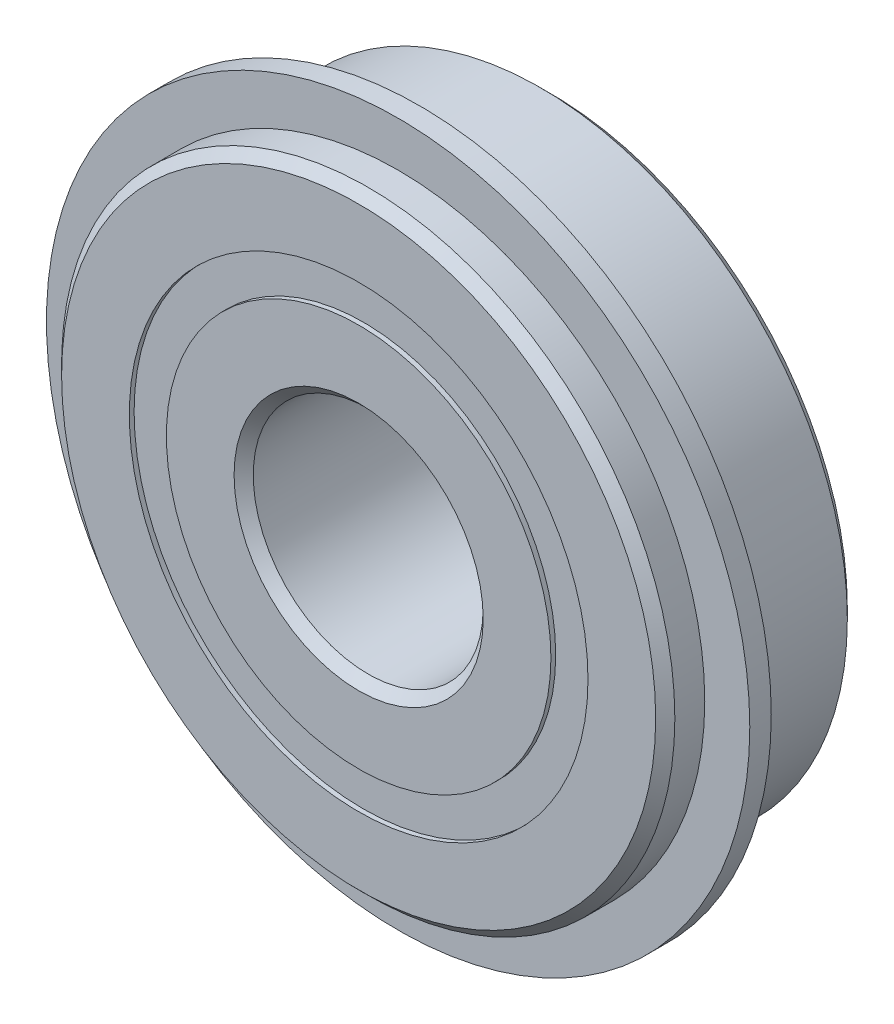
ISO-10303-21;
HEADER;
FILE_DESCRIPTION(('STEP AP214'),'2;1');
FILE_NAME('part.step','',(''),(''),'','','');
FILE_SCHEMA(('AUTOMOTIVE_DESIGN { 1 0 10303 214 1 1 1 1 }'));
ENDSEC;
DATA;
#1=APPLICATION_CONTEXT('core data for automotive mechanical design processes');
#2=APPLICATION_PROTOCOL_DEFINITION('international standard','automotive_design',2000,#1);
#3=PRODUCT_CONTEXT('',#1,'mechanical');
#4=PRODUCT('Part','Part','',(#3));
#5=PRODUCT_RELATED_PRODUCT_CATEGORY('part','',(#4));
#6=PRODUCT_DEFINITION_FORMATION('','',#4);
#7=PRODUCT_DEFINITION_CONTEXT('part definition',#1,'design');
#8=PRODUCT_DEFINITION('design','',#6,#7);
#9=PRODUCT_DEFINITION_SHAPE('','',#8);
#10=(LENGTH_UNIT() NAMED_UNIT(*) SI_UNIT(.MILLI.,.METRE.));
#11=(NAMED_UNIT(*) PLANE_ANGLE_UNIT() SI_UNIT($,.RADIAN.));
#12=(NAMED_UNIT(*) SI_UNIT($,.STERADIAN.) SOLID_ANGLE_UNIT());
#13=UNCERTAINTY_MEASURE_WITH_UNIT(LENGTH_MEASURE(1.E-05),#10,'distance_accuracy_value','');
#14=(GEOMETRIC_REPRESENTATION_CONTEXT(3) GLOBAL_UNCERTAINTY_ASSIGNED_CONTEXT((#13)) GLOBAL_UNIT_ASSIGNED_CONTEXT((#10,
#11,#12)) REPRESENTATION_CONTEXT('',''));
#15=CARTESIAN_POINT('',(0.,0.,0.));
#16=DIRECTION('',(0.,0.,1.));
#17=DIRECTION('',(1.,0.,0.));
#18=AXIS2_PLACEMENT_3D('',#15,#16,#17);
#19=CARTESIAN_POINT('',(0.,11.967032967033,-4.75000000000001));
#20=DIRECTION('',(0.,0.,1.));
#21=DIRECTION('',(1.,0.,0.));
#22=AXIS2_PLACEMENT_3D('',#19,#20,#21);
#23=PLANE('',#22);
#24=CARTESIAN_POINT('',(0.,0.,-4.75000000000001));
#25=DIRECTION('',(0.,0.,1.));
#26=DIRECTION('',(1.,0.,0.));
#27=AXIS2_PLACEMENT_3D('',#24,#25,#26);
#28=CIRCLE('',#27,11.967032967033);
#29=CARTESIAN_POINT('',(11.967032967033,0.,-4.75000000000001));
#30=VERTEX_POINT('',#29);
#31=EDGE_CURVE('E57',#30,#30,#28,.T.);
#32=ORIENTED_EDGE('',*,*,#31,.F.);
#33=EDGE_LOOP('',(#32));
#34=FACE_BOUND('',#33,.T.);
#35=CARTESIAN_POINT('',(0.,0.,-4.75000000000001));
#36=DIRECTION('',(0.,0.,1.));
#37=DIRECTION('',(1.,0.,0.));
#38=AXIS2_PLACEMENT_3D('',#35,#36,#37);
#39=CIRCLE('',#38,10.032967032967);
#40=CARTESIAN_POINT('',(10.032967032967,0.,-4.75000000000001));
#41=VERTEX_POINT('',#40);
#42=EDGE_CURVE('E11',#41,#41,#39,.T.);
#43=ORIENTED_EDGE('',*,*,#42,.T.);
#44=EDGE_LOOP('',(#43));
#45=FACE_BOUND('',#44,.T.);
#46=ADVANCED_FACE('F43',(#34,#45),#23,.F.);
#47=CARTESIAN_POINT('',(0.,0.,5.));
#48=DIRECTION('',(0.,0.,1.));
#49=DIRECTION('',(1.,0.,0.));
#50=AXIS2_PLACEMENT_3D('',#47,#48,#49);
#51=CYLINDRICAL_SURFACE('',#50,10.032967032967);
#52=ORIENTED_EDGE('',*,*,#42,.F.);
#53=EDGE_LOOP('',(#52));
#54=FACE_BOUND('',#53,.T.);
#55=CARTESIAN_POINT('',(0.,0.,-2.4235148780783));
#56=DIRECTION('',(0.,0.,1.));
#57=DIRECTION('',(1.,0.,0.));
#58=AXIS2_PLACEMENT_3D('',#55,#56,#57);
#59=CIRCLE('',#58,10.032967032967);
#60=CARTESIAN_POINT('',(10.032967032967,0.,-2.4235148780783));
#61=VERTEX_POINT('',#60);
#62=EDGE_CURVE('E49',#61,#61,#59,.T.);
#63=ORIENTED_EDGE('',*,*,#62,.T.);
#64=EDGE_LOOP('',(#63));
#65=FACE_BOUND('',#64,.T.);
#66=ADVANCED_FACE('F66',(#54,#65),#51,.F.);
#67=CARTESIAN_POINT('',(0.,11.967032967033,-2.4235148780783));
#68=DIRECTION('',(0.,0.,-1.));
#69=DIRECTION('',(-1.,0.,0.));
#70=AXIS2_PLACEMENT_3D('',#67,#68,#69);
#71=PLANE('',#70);
#72=ORIENTED_EDGE('',*,*,#62,.F.);
#73=EDGE_LOOP('',(#72));
#74=FACE_BOUND('',#73,.T.);
#75=CARTESIAN_POINT('',(0.,0.,-2.4235148780783));
#76=DIRECTION('',(0.,0.,1.));
#77=DIRECTION('',(1.,0.,0.));
#78=AXIS2_PLACEMENT_3D('',#75,#76,#77);
#79=CIRCLE('',#78,11.967032967033);
#80=CARTESIAN_POINT('',(11.967032967033,0.,-2.4235148780783));
#81=VERTEX_POINT('',#80);
#82=EDGE_CURVE('E53',#81,#81,#79,.T.);
#83=ORIENTED_EDGE('',*,*,#82,.T.);
#84=EDGE_LOOP('',(#83));
#85=FACE_BOUND('',#84,.T.);
#86=ADVANCED_FACE('F70',(#74,#85),#71,.F.);
#87=CARTESIAN_POINT('',(0.,0.,5.));
#88=DIRECTION('',(0.,0.,1.));
#89=DIRECTION('',(1.,0.,0.));
#90=AXIS2_PLACEMENT_3D('',#87,#88,#89);
#91=CYLINDRICAL_SURFACE('',#90,11.967032967033);
#92=ORIENTED_EDGE('',*,*,#82,.F.);
#93=EDGE_LOOP('',(#92));
#94=FACE_BOUND('',#93,.T.);
#95=ORIENTED_EDGE('',*,*,#31,.T.);
#96=EDGE_LOOP('',(#95));
#97=FACE_BOUND('',#96,.T.);
#98=ADVANCED_FACE('F63',(#94,#97),#91,.T.);
#99=CLOSED_SHELL('',(#46,#66,#86,#98));
#100=MANIFOLD_SOLID_BREP('B2',#99);
#101=CARTESIAN_POINT('',(-4.77272113029301,9.91065754692667,0.));
#102=DIRECTION('',(0.,0.,1.));
#103=DIRECTION('',(-0.433883739117546,0.900968867902425,0.));
#104=AXIS2_PLACEMENT_3D('',#101,#102,#103);
#105=SPHERICAL_SURFACE('',#104,2.42351487807829);
#106=CARTESIAN_POINT('',(-4.77272113029301,9.91065754692667,2.42351487807829));
#107=VERTEX_POINT('',#106);
#108=VERTEX_LOOP('',#107);
#109=FACE_BOUND('',#108,.T.);
#110=ADVANCED_FACE('F110',(#109),#105,.T.);
#111=CLOSED_SHELL('',(#110));
#112=MANIFOLD_SOLID_BREP('B6',#111);
#113=CARTESIAN_POINT('',(-8.60014630714824,6.85838782044617,0.));
#114=DIRECTION('',(0.,0.,1.));
#115=DIRECTION('',(-0.781831482468022,0.623489801858743,0.));
#116=AXIS2_PLACEMENT_3D('',#113,#114,#115);
#117=SPHERICAL_SURFACE('',#116,2.42351487807829);
#118=CARTESIAN_POINT('',(-8.60014630714824,6.85838782044617,2.42351487807829));
#119=VERTEX_POINT('',#118);
#120=VERTEX_LOOP('',#119);
#121=FACE_BOUND('',#120,.T.);
#122=ADVANCED_FACE('F130',(#121),#117,.T.);
#123=CLOSED_SHELL('',(#122));
#124=MANIFOLD_SOLID_BREP('B39',#123);
#125=CARTESIAN_POINT('',(-10.724207034,2.44773027351957,0.));
#126=DIRECTION('',(0.,0.,1.));
#127=DIRECTION('',(-0.974927912181821,0.222520933956325,0.));
#128=AXIS2_PLACEMENT_3D('',#125,#126,#127);
#129=SPHERICAL_SURFACE('',#128,2.42351487807829);
#130=CARTESIAN_POINT('',(-10.724207034,2.44773027351957,2.42351487807829));
#131=VERTEX_POINT('',#130);
#132=VERTEX_LOOP('',#131);
#133=FACE_BOUND('',#132,.T.);
#134=ADVANCED_FACE('F150',(#133),#129,.T.);
#135=CLOSED_SHELL('',(#134));
#136=MANIFOLD_SOLID_BREP('B106',#135);
#137=CARTESIAN_POINT('',(-10.7242070340001,-2.44773027351936,0.));
#138=DIRECTION('',(0.,0.,1.));
#139=DIRECTION('',(-0.974927912181826,-0.222520933956305,0.));
#140=AXIS2_PLACEMENT_3D('',#137,#138,#139);
#141=SPHERICAL_SURFACE('',#140,2.42351487807829);
#142=CARTESIAN_POINT('',(-10.7242070340001,-2.44773027351936,2.42351487807829));
#143=VERTEX_POINT('',#142);
#144=VERTEX_LOOP('',#143);
#145=FACE_BOUND('',#144,.T.);
#146=ADVANCED_FACE('F170',(#145),#141,.T.);
#147=CLOSED_SHELL('',(#146));
#148=MANIFOLD_SOLID_BREP('B126',#147);
#149=CARTESIAN_POINT('',(-8.60014630714839,-6.85838782044599,0.));
#150=DIRECTION('',(0.,0.,1.));
#151=DIRECTION('',(-0.781831482468035,-0.623489801858727,0.));
#152=AXIS2_PLACEMENT_3D('',#149,#150,#151);
#153=SPHERICAL_SURFACE('',#152,2.42351487807829);
#154=CARTESIAN_POINT('',(-8.60014630714839,-6.85838782044599,2.42351487807829));
#155=VERTEX_POINT('',#154);
#156=VERTEX_LOOP('',#155);
#157=FACE_BOUND('',#156,.T.);
#158=ADVANCED_FACE('F190',(#157),#153,.T.);
#159=CLOSED_SHELL('',(#158));
#160=MANIFOLD_SOLID_BREP('B146',#159);
#161=CARTESIAN_POINT('',(-4.77272113029322,-9.91065754692657,0.));
#162=DIRECTION('',(0.,0.,1.));
#163=DIRECTION('',(-0.433883739117565,-0.900968867902416,0.));
#164=AXIS2_PLACEMENT_3D('',#161,#162,#163);
#165=SPHERICAL_SURFACE('',#164,2.42351487807829);
#166=CARTESIAN_POINT('',(-4.77272113029322,-9.91065754692657,2.42351487807829));
#167=VERTEX_POINT('',#166);
#168=VERTEX_LOOP('',#167);
#169=FACE_BOUND('',#168,.T.);
#170=ADVANCED_FACE('F210',(#169),#165,.T.);
#171=CLOSED_SHELL('',(#170));
#172=MANIFOLD_SOLID_BREP('B166',#171);
#173=CARTESIAN_POINT('',(0.,-11.,0.));
#174=DIRECTION('',(0.,0.,1.));
#175=DIRECTION('',(0.,-1.,0.));
#176=AXIS2_PLACEMENT_3D('',#173,#174,#175);
#177=SPHERICAL_SURFACE('',#176,2.42351487807829);
#178=CARTESIAN_POINT('',(0.,-11.,2.42351487807829));
#179=VERTEX_POINT('',#178);
#180=VERTEX_LOOP('',#179);
#181=FACE_BOUND('',#180,.T.);
#182=ADVANCED_FACE('F230',(#181),#177,.T.);
#183=CLOSED_SHELL('',(#182));
#184=MANIFOLD_SOLID_BREP('B186',#183);
#185=CARTESIAN_POINT('',(4.77272113029308,-9.91065754692664,0.));
#186=DIRECTION('',(0.,0.,1.));
#187=DIRECTION('',(0.433883739117553,-0.900968867902422,0.));
#188=AXIS2_PLACEMENT_3D('',#185,#186,#187);
#189=SPHERICAL_SURFACE('',#188,2.42351487807829);
#190=CARTESIAN_POINT('',(4.77272113029308,-9.91065754692664,2.42351487807829));
#191=VERTEX_POINT('',#190);
#192=VERTEX_LOOP('',#191);
#193=FACE_BOUND('',#192,.T.);
#194=ADVANCED_FACE('F250',(#193),#189,.T.);
#195=CLOSED_SHELL('',(#194));
#196=MANIFOLD_SOLID_BREP('B206',#195);
#197=CARTESIAN_POINT('',(8.60014630714829,-6.85838782044611,0.));
#198=DIRECTION('',(0.,0.,1.));
#199=DIRECTION('',(0.781831482468027,-0.623489801858737,0.));
#200=AXIS2_PLACEMENT_3D('',#197,#198,#199);
#201=SPHERICAL_SURFACE('',#200,2.42351487807829);
#202=CARTESIAN_POINT('',(8.60014630714829,-6.85838782044611,2.42351487807829));
#203=VERTEX_POINT('',#202);
#204=VERTEX_LOOP('',#203);
#205=FACE_BOUND('',#204,.T.);
#206=ADVANCED_FACE('F270',(#205),#201,.T.);
#207=CLOSED_SHELL('',(#206));
#208=MANIFOLD_SOLID_BREP('B226',#207);
#209=CARTESIAN_POINT('',(10.724207034,-2.4477302735195,0.));
#210=DIRECTION('',(0.,0.,1.));
#211=DIRECTION('',(0.974927912181823,-0.222520933956318,0.));
#212=AXIS2_PLACEMENT_3D('',#209,#210,#211);
#213=SPHERICAL_SURFACE('',#212,2.42351487807829);
#214=CARTESIAN_POINT('',(10.724207034,-2.4477302735195,2.42351487807829));
#215=VERTEX_POINT('',#214);
#216=VERTEX_LOOP('',#215);
#217=FACE_BOUND('',#216,.T.);
#218=ADVANCED_FACE('F290',(#217),#213,.T.);
#219=CLOSED_SHELL('',(#218));
#220=MANIFOLD_SOLID_BREP('B246',#219);
#221=CARTESIAN_POINT('',(10.7242070340001,2.44773027351943,0.));
#222=DIRECTION('',(0.,0.,1.));
#223=DIRECTION('',(0.974927912181824,0.222520933956311,0.));
#224=AXIS2_PLACEMENT_3D('',#221,#222,#223);
#225=SPHERICAL_SURFACE('',#224,2.42351487807829);
#226=CARTESIAN_POINT('',(10.7242070340001,2.44773027351943,2.42351487807829));
#227=VERTEX_POINT('',#226);
#228=VERTEX_LOOP('',#227);
#229=FACE_BOUND('',#228,.T.);
#230=ADVANCED_FACE('F310',(#229),#225,.T.);
#231=CLOSED_SHELL('',(#230));
#232=MANIFOLD_SOLID_BREP('B266',#231);
#233=CARTESIAN_POINT('',(8.60014630714834,6.85838782044605,0.));
#234=DIRECTION('',(0.,0.,1.));
#235=DIRECTION('',(0.781831482468031,0.623489801858732,0.));
#236=AXIS2_PLACEMENT_3D('',#233,#234,#235);
#237=SPHERICAL_SURFACE('',#236,2.42351487807829);
#238=CARTESIAN_POINT('',(8.60014630714834,6.85838782044605,2.42351487807829));
#239=VERTEX_POINT('',#238);
#240=VERTEX_LOOP('',#239);
#241=FACE_BOUND('',#240,.T.);
#242=ADVANCED_FACE('F330',(#241),#237,.T.);
#243=CLOSED_SHELL('',(#242));
#244=MANIFOLD_SOLID_BREP('B286',#243);
#245=CARTESIAN_POINT('',(4.77272113029315,9.9106575469266,0.));
#246=DIRECTION('',(0.,0.,1.));
#247=DIRECTION('',(0.433883739117559,0.900968867902419,0.));
#248=AXIS2_PLACEMENT_3D('',#245,#246,#247);
#249=SPHERICAL_SURFACE('',#248,2.42351487807829);
#250=CARTESIAN_POINT('',(4.77272113029315,9.9106575469266,2.42351487807829));
#251=VERTEX_POINT('',#250);
#252=VERTEX_LOOP('',#251);
#253=FACE_BOUND('',#252,.T.);
#254=ADVANCED_FACE('F350',(#253),#249,.T.);
#255=CLOSED_SHELL('',(#254));
#256=MANIFOLD_SOLID_BREP('B306',#255);
#257=CARTESIAN_POINT('',(0.,11.,0.));
#258=DIRECTION('',(0.,0.,1.));
#259=DIRECTION('',(0.,1.,0.));
#260=AXIS2_PLACEMENT_3D('',#257,#258,#259);
#261=SPHERICAL_SURFACE('',#260,2.42351487807829);
#262=CARTESIAN_POINT('',(0.,11.,2.42351487807829));
#263=VERTEX_POINT('',#262);
#264=VERTEX_LOOP('',#263);
#265=FACE_BOUND('',#264,.T.);
#266=ADVANCED_FACE('F371',(#265),#261,.T.);
#267=CLOSED_SHELL('',(#266));
#268=MANIFOLD_SOLID_BREP('B326',#267);
#269=CARTESIAN_POINT('',(0.,0.,5.));
#270=DIRECTION('',(0.,0.,1.));
#271=DIRECTION('',(1.,0.,0.));
#272=AXIS2_PLACEMENT_3D('',#269,#270,#271);
#273=CYLINDRICAL_SURFACE('',#272,11.967032967033);
#274=CARTESIAN_POINT('',(0.,0.,5.));
#275=DIRECTION('',(0.,0.,1.));
#276=DIRECTION('',(1.,0.,0.));
#277=AXIS2_PLACEMENT_3D('',#274,#275,#276);
#278=CIRCLE('',#277,11.967032967033);
#279=CARTESIAN_POINT('',(11.967032967033,0.,5.));
#280=VERTEX_POINT('',#279);
#281=EDGE_CURVE('E421',#280,#280,#278,.T.);
#282=ORIENTED_EDGE('',*,*,#281,.T.);
#283=EDGE_LOOP('',(#282));
#284=FACE_BOUND('',#283,.T.);
#285=CARTESIAN_POINT('',(0.,0.,4.75));
#286=DIRECTION('',(0.,0.,-1.));
#287=DIRECTION('',(-1.,0.,0.));
#288=AXIS2_PLACEMENT_3D('',#285,#286,#287);
#289=CIRCLE('',#288,11.967032967033);
#290=CARTESIAN_POINT('',(-11.967032967033,0.,4.75));
#291=VERTEX_POINT('',#290);
#292=EDGE_CURVE('E370',#291,#291,#289,.F.);
#293=ORIENTED_EDGE('',*,*,#292,.F.);
#294=EDGE_LOOP('',(#293));
#295=FACE_BOUND('',#294,.T.);
#296=ADVANCED_FACE('F383',(#284,#295),#273,.F.);
#297=CARTESIAN_POINT('',(0.,0.,2.22222222222222));
#298=DIRECTION('',(0.,0.,1.));
#299=DIRECTION('',(1.,0.,0.));
#300=AXIS2_PLACEMENT_3D('',#297,#298,#299);
#301=CIRCLE('',#300,11.967032967033);
#302=CARTESIAN_POINT('',(11.967032967033,0.,2.22222222222222));
#303=VERTEX_POINT('',#302);
#304=EDGE_CURVE('E418',#303,#303,#301,.T.);
#305=ORIENTED_EDGE('',*,*,#304,.F.);
#306=EDGE_LOOP('',(#305));
#307=FACE_BOUND('',#306,.T.);
#308=CARTESIAN_POINT('',(0.,0.,2.42351487807829));
#309=DIRECTION('',(0.,0.,1.));
#310=DIRECTION('',(1.,0.,0.));
#311=AXIS2_PLACEMENT_3D('',#308,#309,#310);
#312=CIRCLE('',#311,11.967032967033);
#313=CARTESIAN_POINT('',(11.967032967033,0.,2.42351487807829));
#314=VERTEX_POINT('',#313);
#315=EDGE_CURVE('E390',#314,#314,#312,.F.);
#316=ORIENTED_EDGE('',*,*,#315,.F.);
#317=EDGE_LOOP('',(#316));
#318=FACE_BOUND('',#317,.T.);
#319=ADVANCED_FACE('F494',(#307,#318),#273,.F.);
#320=CARTESIAN_POINT('',(0.,0.,5.));
#321=DIRECTION('',(0.,0.,1.));
#322=DIRECTION('',(1.,0.,0.));
#323=AXIS2_PLACEMENT_3D('',#320,#321,#322);
#324=CYLINDRICAL_SURFACE('',#323,16.);
#325=CARTESIAN_POINT('',(0.,0.,4.5));
#326=DIRECTION('',(0.,0.,1.));
#327=DIRECTION('',(1.,0.,0.));
#328=AXIS2_PLACEMENT_3D('',#325,#326,#327);
#329=CIRCLE('',#328,16.);
#330=CARTESIAN_POINT('',(16.,0.,4.5));
#331=VERTEX_POINT('',#330);
#332=EDGE_CURVE('E403',#331,#331,#329,.T.);
#333=ORIENTED_EDGE('',*,*,#332,.F.);
#334=EDGE_LOOP('',(#333));
#335=FACE_BOUND('',#334,.T.);
#336=CARTESIAN_POINT('',(0.,0.,2.94));
#337=DIRECTION('',(0.,0.,-1.));
#338=DIRECTION('',(-1.,0.,0.));
#339=AXIS2_PLACEMENT_3D('',#336,#337,#338);
#340=CIRCLE('',#339,16.);
#341=CARTESIAN_POINT('',(-16.,0.,2.94));
#342=VERTEX_POINT('',#341);
#343=EDGE_CURVE('E394',#342,#342,#340,.T.);
#344=ORIENTED_EDGE('',*,*,#343,.F.);
#345=EDGE_LOOP('',(#344));
#346=FACE_BOUND('',#345,.T.);
#347=ADVANCED_FACE('F500',(#335,#346),#324,.T.);
#348=CARTESIAN_POINT('',(0.,0.,-4.50000000000001));
#349=DIRECTION('',(0.,0.,1.));
#350=DIRECTION('',(1.,0.,0.));
#351=AXIS2_PLACEMENT_3D('',#348,#349,#350);
#352=CIRCLE('',#351,16.);
#353=CARTESIAN_POINT('',(16.,0.,-4.50000000000001));
#354=VERTEX_POINT('',#353);
#355=EDGE_CURVE('E406',#354,#354,#352,.T.);
#356=ORIENTED_EDGE('',*,*,#355,.T.);
#357=EDGE_LOOP('',(#356));
#358=FACE_BOUND('',#357,.T.);
#359=CARTESIAN_POINT('',(0.,0.,1.82));
#360=DIRECTION('',(0.,0.,1.));
#361=DIRECTION('',(1.,0.,0.));
#362=AXIS2_PLACEMENT_3D('',#359,#360,#361);
#363=CIRCLE('',#362,16.);
#364=CARTESIAN_POINT('',(16.,0.,1.82));
#365=VERTEX_POINT('',#364);
#366=EDGE_CURVE('E398',#365,#365,#363,.T.);
#367=ORIENTED_EDGE('',*,*,#366,.F.);
#368=EDGE_LOOP('',(#367));
#369=FACE_BOUND('',#368,.T.);
#370=ADVANCED_FACE('F523',(#358,#369),#324,.T.);
#371=CARTESIAN_POINT('',(0.,0.,4.5));
#372=DIRECTION('',(0.,0.,-1.));
#373=DIRECTION('',(-1.,0.,0.));
#374=AXIS2_PLACEMENT_3D('',#371,#372,#373);
#375=CONICAL_SURFACE('',#374,16.,0.785398163397447);
#376=CARTESIAN_POINT('',(0.,0.,5.));
#377=DIRECTION('',(0.,0.,1.));
#378=DIRECTION('',(1.,0.,0.));
#379=AXIS2_PLACEMENT_3D('',#376,#377,#378);
#380=CIRCLE('',#379,15.5);
#381=CARTESIAN_POINT('',(15.5,0.,5.));
#382=VERTEX_POINT('',#381);
#383=EDGE_CURVE('E424',#382,#382,#380,.T.);
#384=ORIENTED_EDGE('',*,*,#383,.F.);
#385=EDGE_LOOP('',(#384));
#386=FACE_BOUND('',#385,.T.);
#387=ORIENTED_EDGE('',*,*,#332,.T.);
#388=EDGE_LOOP('',(#387));
#389=FACE_BOUND('',#388,.T.);
#390=ADVANCED_FACE('F385',(#386,#389),#375,.T.);
#391=CARTESIAN_POINT('',(0.,0.,-5.00000000000001));
#392=DIRECTION('',(0.,0.,1.));
#393=DIRECTION('',(1.,0.,0.));
#394=AXIS2_PLACEMENT_3D('',#391,#392,#393);
#395=CONICAL_SURFACE('',#394,15.5,0.785398163397445);
#396=ORIENTED_EDGE('',*,*,#355,.F.);
#397=EDGE_LOOP('',(#396));
#398=FACE_BOUND('',#397,.T.);
#399=CARTESIAN_POINT('',(0.,0.,-5.00000000000001));
#400=DIRECTION('',(0.,0.,1.));
#401=DIRECTION('',(1.,0.,0.));
#402=AXIS2_PLACEMENT_3D('',#399,#400,#401);
#403=CIRCLE('',#402,15.5);
#404=CARTESIAN_POINT('',(15.5,0.,-5.00000000000001));
#405=VERTEX_POINT('',#404);
#406=EDGE_CURVE('E409',#405,#405,#403,.T.);
#407=ORIENTED_EDGE('',*,*,#406,.T.);
#408=EDGE_LOOP('',(#407));
#409=FACE_BOUND('',#408,.T.);
#410=ADVANCED_FACE('F518',(#398,#409),#395,.T.);
#411=CARTESIAN_POINT('',(0.,15.5,-5.00000000000001));
#412=DIRECTION('',(0.,0.,1.));
#413=DIRECTION('',(1.,0.,0.));
#414=AXIS2_PLACEMENT_3D('',#411,#412,#413);
#415=PLANE('',#414);
#416=ORIENTED_EDGE('',*,*,#406,.F.);
#417=EDGE_LOOP('',(#416));
#418=FACE_BOUND('',#417,.T.);
#419=CARTESIAN_POINT('',(0.,0.,-5.00000000000001));
#420=DIRECTION('',(0.,0.,1.));
#421=DIRECTION('',(1.,0.,0.));
#422=AXIS2_PLACEMENT_3D('',#419,#420,#421);
#423=CIRCLE('',#422,11.967032967033);
#424=CARTESIAN_POINT('',(11.967032967033,0.,-5.00000000000001));
#425=VERTEX_POINT('',#424);
#426=EDGE_CURVE('E412',#425,#425,#423,.T.);
#427=ORIENTED_EDGE('',*,*,#426,.T.);
#428=EDGE_LOOP('',(#427));
#429=FACE_BOUND('',#428,.T.);
#430=ADVANCED_FACE('F514',(#418,#429),#415,.F.);
#431=CARTESIAN_POINT('',(0.,0.,5.));
#432=DIRECTION('',(0.,0.,1.));
#433=DIRECTION('',(1.,0.,0.));
#434=AXIS2_PLACEMENT_3D('',#431,#432,#433);
#435=CYLINDRICAL_SURFACE('',#434,11.967032967033);
#436=ORIENTED_EDGE('',*,*,#426,.F.);
#437=EDGE_LOOP('',(#436));
#438=FACE_BOUND('',#437,.T.);
#439=CARTESIAN_POINT('',(0.,0.,-2.22222222222223));
#440=DIRECTION('',(0.,0.,1.));
#441=DIRECTION('',(1.,0.,0.));
#442=AXIS2_PLACEMENT_3D('',#439,#440,#441);
#443=CIRCLE('',#442,11.967032967033);
#444=CARTESIAN_POINT('',(11.967032967033,0.,-2.22222222222223));
#445=VERTEX_POINT('',#444);
#446=EDGE_CURVE('E415',#445,#445,#443,.T.);
#447=ORIENTED_EDGE('',*,*,#446,.T.);
#448=EDGE_LOOP('',(#447));
#449=FACE_BOUND('',#448,.T.);
#450=ADVANCED_FACE('F510',(#438,#449),#435,.F.);
#451=CARTESIAN_POINT('',(0.,0.,0.));
#452=DIRECTION('',(0.,0.,1.));
#453=DIRECTION('',(1.,0.,0.));
#454=AXIS2_PLACEMENT_3D('',#451,#452,#453);
#455=TOROIDAL_SURFACE('',#454,11.,2.42351487807829);
#456=ORIENTED_EDGE('',*,*,#446,.F.);
#457=EDGE_LOOP('',(#456));
#458=FACE_BOUND('',#457,.T.);
#459=ORIENTED_EDGE('',*,*,#304,.T.);
#460=EDGE_LOOP('',(#459));
#461=FACE_BOUND('',#460,.T.);
#462=ADVANCED_FACE('F507',(#458,#461),#455,.F.);
#463=CARTESIAN_POINT('',(0.,15.5,5.));
#464=DIRECTION('',(0.,0.,-1.));
#465=DIRECTION('',(-1.,0.,0.));
#466=AXIS2_PLACEMENT_3D('',#463,#464,#465);
#467=PLANE('',#466);
#468=ORIENTED_EDGE('',*,*,#281,.F.);
#469=EDGE_LOOP('',(#468));
#470=FACE_BOUND('',#469,.T.);
#471=ORIENTED_EDGE('',*,*,#383,.T.);
#472=EDGE_LOOP('',(#471));
#473=FACE_BOUND('',#472,.T.);
#474=ADVANCED_FACE('F505',(#470,#473),#467,.F.);
#475=CARTESIAN_POINT('',(0.,18.35,2.94));
#476=DIRECTION('',(0.,0.,-1.));
#477=DIRECTION('',(-1.,0.,0.));
#478=AXIS2_PLACEMENT_3D('',#475,#476,#477);
#479=PLANE('',#478);
#480=CARTESIAN_POINT('',(0.,0.,2.94));
#481=DIRECTION('',(0.,0.,1.));
#482=DIRECTION('',(1.,0.,0.));
#483=AXIS2_PLACEMENT_3D('',#480,#481,#482);
#484=CIRCLE('',#483,18.35);
#485=CARTESIAN_POINT('',(18.35,0.,2.94));
#486=VERTEX_POINT('',#485);
#487=EDGE_CURVE('E430',#486,#486,#484,.T.);
#488=ORIENTED_EDGE('',*,*,#487,.T.);
#489=EDGE_LOOP('',(#488));
#490=FACE_BOUND('',#489,.T.);
#491=ORIENTED_EDGE('',*,*,#343,.T.);
#492=EDGE_LOOP('',(#491));
#493=FACE_BOUND('',#492,.T.);
#494=ADVANCED_FACE('F533',(#490,#493),#479,.F.);
#495=CARTESIAN_POINT('',(0.,18.35,1.82));
#496=DIRECTION('',(0.,0.,1.));
#497=DIRECTION('',(1.,0.,0.));
#498=AXIS2_PLACEMENT_3D('',#495,#496,#497);
#499=PLANE('',#498);
#500=CARTESIAN_POINT('',(0.,0.,1.82));
#501=DIRECTION('',(0.,0.,1.));
#502=DIRECTION('',(1.,0.,0.));
#503=AXIS2_PLACEMENT_3D('',#500,#501,#502);
#504=CIRCLE('',#503,18.35);
#505=CARTESIAN_POINT('',(18.35,0.,1.82));
#506=VERTEX_POINT('',#505);
#507=EDGE_CURVE('E427',#506,#506,#504,.T.);
#508=ORIENTED_EDGE('',*,*,#507,.F.);
#509=EDGE_LOOP('',(#508));
#510=FACE_BOUND('',#509,.T.);
#511=ORIENTED_EDGE('',*,*,#366,.T.);
#512=EDGE_LOOP('',(#511));
#513=FACE_BOUND('',#512,.T.);
#514=ADVANCED_FACE('F490',(#510,#513),#499,.F.);
#515=CARTESIAN_POINT('',(0.,0.,9.13349869253424));
#516=DIRECTION('',(0.,0.,1.));
#517=DIRECTION('',(1.,0.,0.));
#518=AXIS2_PLACEMENT_3D('',#515,#516,#517);
#519=CYLINDRICAL_SURFACE('',#518,18.35);
#520=ORIENTED_EDGE('',*,*,#487,.F.);
#521=EDGE_LOOP('',(#520));
#522=FACE_BOUND('',#521,.T.);
#523=ORIENTED_EDGE('',*,*,#507,.T.);
#524=EDGE_LOOP('',(#523));
#525=FACE_BOUND('',#524,.T.);
#526=ADVANCED_FACE('F483',(#522,#525),#519,.T.);
#527=CARTESIAN_POINT('',(0.,11.967032967033,4.75));
#528=DIRECTION('',(0.,0.,-1.));
#529=DIRECTION('',(-1.,0.,0.));
#530=AXIS2_PLACEMENT_3D('',#527,#528,#529);
#531=PLANE('',#530);
#532=CARTESIAN_POINT('',(0.,0.,4.75));
#533=DIRECTION('',(0.,0.,1.));
#534=DIRECTION('',(1.,0.,0.));
#535=AXIS2_PLACEMENT_3D('',#532,#533,#534);
#536=CIRCLE('',#535,10.032967032967);
#537=CARTESIAN_POINT('',(10.032967032967,0.,4.75));
#538=VERTEX_POINT('',#537);
#539=EDGE_CURVE('E433',#538,#538,#536,.T.);
#540=ORIENTED_EDGE('',*,*,#539,.F.);
#541=EDGE_LOOP('',(#540));
#542=FACE_BOUND('',#541,.T.);
#543=ORIENTED_EDGE('',*,*,#292,.T.);
#544=EDGE_LOOP('',(#543));
#545=FACE_BOUND('',#544,.T.);
#546=ADVANCED_FACE('F481',(#542,#545),#531,.F.);
#547=CARTESIAN_POINT('',(0.,11.967032967033,2.42351487807829));
#548=DIRECTION('',(0.,0.,1.));
#549=DIRECTION('',(1.,0.,0.));
#550=AXIS2_PLACEMENT_3D('',#547,#548,#549);
#551=PLANE('',#550);
#552=ORIENTED_EDGE('',*,*,#315,.T.);
#553=EDGE_LOOP('',(#552));
#554=FACE_BOUND('',#553,.T.);
#555=CARTESIAN_POINT('',(0.,0.,2.42351487807829));
#556=DIRECTION('',(0.,0.,1.));
#557=DIRECTION('',(1.,0.,0.));
#558=AXIS2_PLACEMENT_3D('',#555,#556,#557);
#559=CIRCLE('',#558,10.032967032967);
#560=CARTESIAN_POINT('',(10.032967032967,0.,2.42351487807829));
#561=VERTEX_POINT('',#560);
#562=EDGE_CURVE('E436',#561,#561,#559,.F.);
#563=ORIENTED_EDGE('',*,*,#562,.F.);
#564=EDGE_LOOP('',(#563));
#565=FACE_BOUND('',#564,.T.);
#566=ADVANCED_FACE('F477',(#554,#565),#551,.F.);
#567=CARTESIAN_POINT('',(0.,0.,5.));
#568=DIRECTION('',(0.,0.,1.));
#569=DIRECTION('',(1.,0.,0.));
#570=AXIS2_PLACEMENT_3D('',#567,#568,#569);
#571=CYLINDRICAL_SURFACE('',#570,10.032967032967);
#572=CARTESIAN_POINT('',(0.,0.,5.));
#573=DIRECTION('',(0.,0.,1.));
#574=DIRECTION('',(1.,0.,0.));
#575=AXIS2_PLACEMENT_3D('',#572,#573,#574);
#576=CIRCLE('',#575,10.032967032967);
#577=CARTESIAN_POINT('',(10.032967032967,0.,5.));
#578=VERTEX_POINT('',#577);
#579=EDGE_CURVE('E439',#578,#578,#576,.T.);
#580=ORIENTED_EDGE('',*,*,#579,.F.);
#581=EDGE_LOOP('',(#580));
#582=FACE_BOUND('',#581,.T.);
#583=ORIENTED_EDGE('',*,*,#539,.T.);
#584=EDGE_LOOP('',(#583));
#585=FACE_BOUND('',#584,.T.);
#586=ADVANCED_FACE('F474',(#582,#585),#571,.T.);
#587=CARTESIAN_POINT('',(0.,0.,2.22222222222222));
#588=DIRECTION('',(0.,0.,1.));
#589=DIRECTION('',(1.,0.,0.));
#590=AXIS2_PLACEMENT_3D('',#587,#588,#589);
#591=CIRCLE('',#590,10.032967032967);
#592=CARTESIAN_POINT('',(10.032967032967,0.,2.22222222222222));
#593=VERTEX_POINT('',#592);
#594=EDGE_CURVE('E442',#593,#593,#591,.T.);
#595=ORIENTED_EDGE('',*,*,#594,.T.);
#596=EDGE_LOOP('',(#595));
#597=FACE_BOUND('',#596,.T.);
#598=ORIENTED_EDGE('',*,*,#562,.T.);
#599=EDGE_LOOP('',(#598));
#600=FACE_BOUND('',#599,.T.);
#601=ADVANCED_FACE('F470',(#597,#600),#571,.T.);
#602=CARTESIAN_POINT('',(0.,10.032967032967,5.));
#603=DIRECTION('',(0.,0.,-1.));
#604=DIRECTION('',(-1.,0.,0.));
#605=AXIS2_PLACEMENT_3D('',#602,#603,#604);
#606=PLANE('',#605);
#607=CARTESIAN_POINT('',(0.,0.,5.));
#608=DIRECTION('',(0.,0.,1.));
#609=DIRECTION('',(1.,0.,0.));
#610=AXIS2_PLACEMENT_3D('',#607,#608,#609);
#611=CIRCLE('',#610,6.5);
#612=CARTESIAN_POINT('',(6.5,0.,5.));
#613=VERTEX_POINT('',#612);
#614=EDGE_CURVE('E460',#613,#613,#611,.T.);
#615=ORIENTED_EDGE('',*,*,#614,.F.);
#616=EDGE_LOOP('',(#615));
#617=FACE_BOUND('',#616,.T.);
#618=ORIENTED_EDGE('',*,*,#579,.T.);
#619=EDGE_LOOP('',(#618));
#620=FACE_BOUND('',#619,.T.);
#621=ADVANCED_FACE('F466',(#617,#620),#606,.F.);
#622=CARTESIAN_POINT('',(0.,0.,0.));
#623=DIRECTION('',(0.,0.,1.));
#624=DIRECTION('',(1.,0.,0.));
#625=AXIS2_PLACEMENT_3D('',#622,#623,#624);
#626=TOROIDAL_SURFACE('',#625,11.,2.42351487807829);
#627=ORIENTED_EDGE('',*,*,#594,.F.);
#628=EDGE_LOOP('',(#627));
#629=FACE_BOUND('',#628,.T.);
#630=CARTESIAN_POINT('',(0.,0.,-2.22222222222222));
#631=DIRECTION('',(0.,0.,1.));
#632=DIRECTION('',(1.,0.,0.));
#633=AXIS2_PLACEMENT_3D('',#630,#631,#632);
#634=CIRCLE('',#633,10.032967032967);
#635=CARTESIAN_POINT('',(10.032967032967,0.,-2.22222222222222));
#636=VERTEX_POINT('',#635);
#637=EDGE_CURVE('E445',#636,#636,#634,.T.);
#638=ORIENTED_EDGE('',*,*,#637,.T.);
#639=EDGE_LOOP('',(#638));
#640=FACE_BOUND('',#639,.T.);
#641=ADVANCED_FACE('F469',(#629,#640),#626,.F.);
#642=CARTESIAN_POINT('',(0.,0.,5.));
#643=DIRECTION('',(0.,0.,1.));
#644=DIRECTION('',(1.,0.,0.));
#645=AXIS2_PLACEMENT_3D('',#642,#643,#644);
#646=CYLINDRICAL_SURFACE('',#645,10.032967032967);
#647=ORIENTED_EDGE('',*,*,#637,.F.);
#648=EDGE_LOOP('',(#647));
#649=FACE_BOUND('',#648,.T.);
#650=CARTESIAN_POINT('',(0.,0.,-5.00000000000001));
#651=DIRECTION('',(0.,0.,1.));
#652=DIRECTION('',(1.,0.,0.));
#653=AXIS2_PLACEMENT_3D('',#650,#651,#652);
#654=CIRCLE('',#653,10.032967032967);
#655=CARTESIAN_POINT('',(10.032967032967,0.,-5.00000000000001));
#656=VERTEX_POINT('',#655);
#657=EDGE_CURVE('E448',#656,#656,#654,.T.);
#658=ORIENTED_EDGE('',*,*,#657,.T.);
#659=EDGE_LOOP('',(#658));
#660=FACE_BOUND('',#659,.T.);
#661=ADVANCED_FACE('F655',(#649,#660),#646,.T.);
#662=CARTESIAN_POINT('',(0.,6.5,-5.00000000000001));
#663=DIRECTION('',(0.,0.,1.));
#664=DIRECTION('',(1.,0.,0.));
#665=AXIS2_PLACEMENT_3D('',#662,#663,#664);
#666=PLANE('',#665);
#667=ORIENTED_EDGE('',*,*,#657,.F.);
#668=EDGE_LOOP('',(#667));
#669=FACE_BOUND('',#668,.T.);
#670=CARTESIAN_POINT('',(0.,0.,-5.00000000000001));
#671=DIRECTION('',(0.,0.,1.));
#672=DIRECTION('',(1.,0.,0.));
#673=AXIS2_PLACEMENT_3D('',#670,#671,#672);
#674=CIRCLE('',#673,6.5);
#675=CARTESIAN_POINT('',(6.5,0.,-5.00000000000001));
#676=VERTEX_POINT('',#675);
#677=EDGE_CURVE('E451',#676,#676,#674,.T.);
#678=ORIENTED_EDGE('',*,*,#677,.T.);
#679=EDGE_LOOP('',(#678));
#680=FACE_BOUND('',#679,.T.);
#681=ADVANCED_FACE('F665',(#669,#680),#666,.F.);
#682=CARTESIAN_POINT('',(0.,0.,-4.50000000000001));
#683=DIRECTION('',(0.,0.,-1.));
#684=DIRECTION('',(-1.,0.,0.));
#685=AXIS2_PLACEMENT_3D('',#682,#683,#684);
#686=CONICAL_SURFACE('',#685,6.,0.785398163397448);
#687=ORIENTED_EDGE('',*,*,#677,.F.);
#688=EDGE_LOOP('',(#687));
#689=FACE_BOUND('',#688,.T.);
#690=CARTESIAN_POINT('',(0.,0.,-4.50000000000001));
#691=DIRECTION('',(0.,0.,1.));
#692=DIRECTION('',(1.,0.,0.));
#693=AXIS2_PLACEMENT_3D('',#690,#691,#692);
#694=CIRCLE('',#693,6.);
#695=CARTESIAN_POINT('',(6.,0.,-4.50000000000001));
#696=VERTEX_POINT('',#695);
#697=EDGE_CURVE('E454',#696,#696,#694,.T.);
#698=ORIENTED_EDGE('',*,*,#697,.T.);
#699=EDGE_LOOP('',(#698));
#700=FACE_BOUND('',#699,.T.);
#701=ADVANCED_FACE('F675',(#689,#700),#686,.F.);
#702=CARTESIAN_POINT('',(0.,0.,5.));
#703=DIRECTION('',(0.,0.,1.));
#704=DIRECTION('',(1.,0.,0.));
#705=AXIS2_PLACEMENT_3D('',#702,#703,#704);
#706=CYLINDRICAL_SURFACE('',#705,6.);
#707=ORIENTED_EDGE('',*,*,#697,.F.);
#708=EDGE_LOOP('',(#707));
#709=FACE_BOUND('',#708,.T.);
#710=CARTESIAN_POINT('',(0.,0.,4.5));
#711=DIRECTION('',(0.,0.,1.));
#712=DIRECTION('',(1.,0.,0.));
#713=AXIS2_PLACEMENT_3D('',#710,#711,#712);
#714=CIRCLE('',#713,6.);
#715=CARTESIAN_POINT('',(6.,0.,4.5));
#716=VERTEX_POINT('',#715);
#717=EDGE_CURVE('E457',#716,#716,#714,.T.);
#718=ORIENTED_EDGE('',*,*,#717,.T.);
#719=EDGE_LOOP('',(#718));
#720=FACE_BOUND('',#719,.T.);
#721=ADVANCED_FACE('F685',(#709,#720),#706,.F.);
#722=CARTESIAN_POINT('',(0.,0.,5.));
#723=DIRECTION('',(0.,0.,1.));
#724=DIRECTION('',(1.,0.,0.));
#725=AXIS2_PLACEMENT_3D('',#722,#723,#724);
#726=CONICAL_SURFACE('',#725,6.5,0.785398163397449);
#727=ORIENTED_EDGE('',*,*,#717,.F.);
#728=EDGE_LOOP('',(#727));
#729=FACE_BOUND('',#728,.T.);
#730=ORIENTED_EDGE('',*,*,#614,.T.);
#731=EDGE_LOOP('',(#730));
#732=FACE_BOUND('',#731,.T.);
#733=ADVANCED_FACE('F464',(#729,#732),#726,.F.);
#734=CLOSED_SHELL('',(#296,#319,#347,#370,#390,#410,#430,#450,#462,#474,#494,#514,#526,#546,
#566,#586,#601,#621,#641,#661,#681,#701,#721,#733));
#735=MANIFOLD_SOLID_BREP('B346',#734);
#736=ADVANCED_BREP_SHAPE_REPRESENTATION('',(#18,#100,#112,#124,#136,#148,#160,#172,#184,#196,
#208,#220,#232,#244,#256,#268,#735),#14);
#737=SHAPE_DEFINITION_REPRESENTATION(#9,#736);
ENDSEC;
END-ISO-10303-21;
